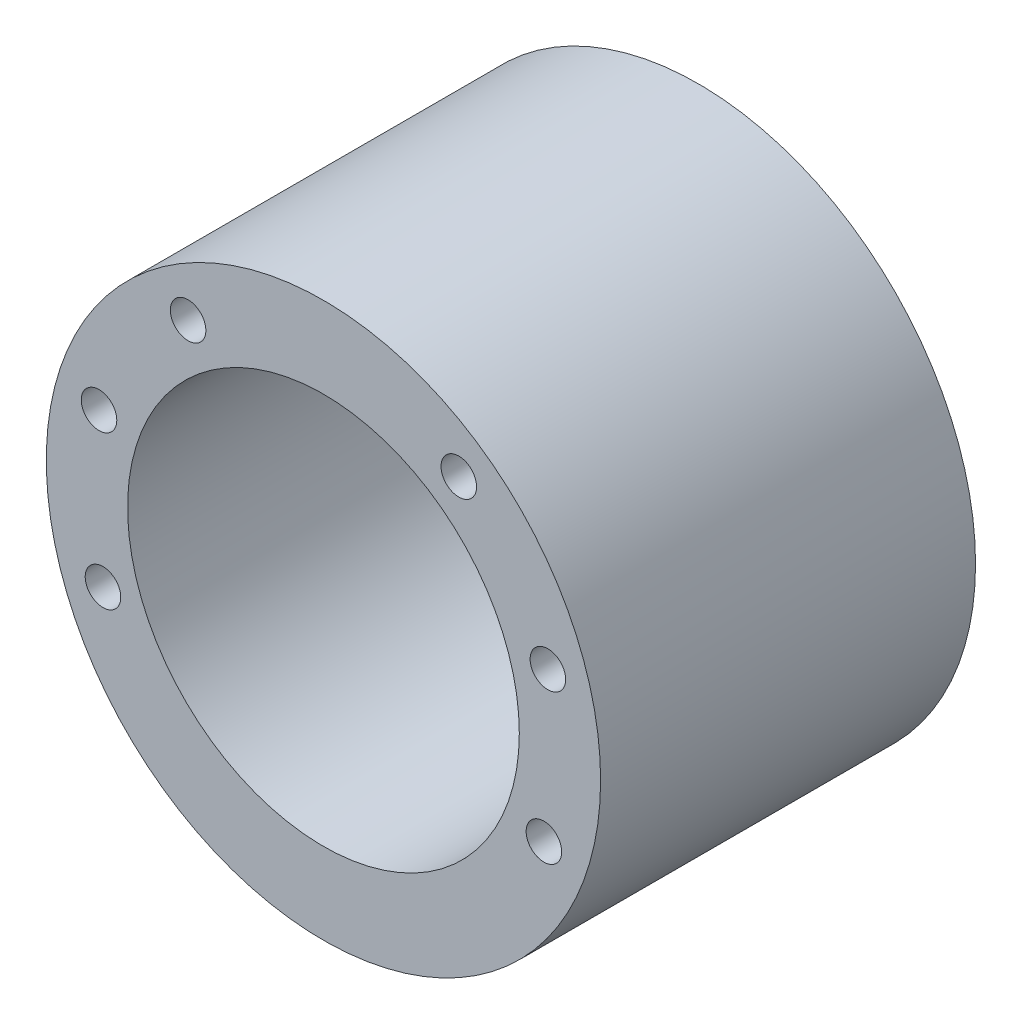
ISO-10303-21;
HEADER;
FILE_DESCRIPTION(('STEP AP214'),'2;1');
FILE_NAME('part.step','',(''),(''),'','','');
FILE_SCHEMA(('AUTOMOTIVE_DESIGN { 1 0 10303 214 1 1 1 1 }'));
ENDSEC;
DATA;
#1=APPLICATION_CONTEXT('core data for automotive mechanical design processes');
#2=APPLICATION_PROTOCOL_DEFINITION('international standard','automotive_design',2000,#1);
#3=PRODUCT_CONTEXT('',#1,'mechanical');
#4=PRODUCT('Part','Part','',(#3));
#5=PRODUCT_RELATED_PRODUCT_CATEGORY('part','',(#4));
#6=PRODUCT_DEFINITION_FORMATION('','',#4);
#7=PRODUCT_DEFINITION_CONTEXT('part definition',#1,'design');
#8=PRODUCT_DEFINITION('design','',#6,#7);
#9=PRODUCT_DEFINITION_SHAPE('','',#8);
#10=(LENGTH_UNIT() NAMED_UNIT(*) SI_UNIT(.MILLI.,.METRE.));
#11=(NAMED_UNIT(*) PLANE_ANGLE_UNIT() SI_UNIT($,.RADIAN.));
#12=(NAMED_UNIT(*) SI_UNIT($,.STERADIAN.) SOLID_ANGLE_UNIT());
#13=UNCERTAINTY_MEASURE_WITH_UNIT(LENGTH_MEASURE(1.E-05),#10,'distance_accuracy_value','');
#14=(GEOMETRIC_REPRESENTATION_CONTEXT(3) GLOBAL_UNCERTAINTY_ASSIGNED_CONTEXT((#13)) GLOBAL_UNIT_ASSIGNED_CONTEXT((#10,
#11,#12)) REPRESENTATION_CONTEXT('',''));
#15=CARTESIAN_POINT('',(0.,0.,0.));
#16=DIRECTION('',(0.,0.,1.));
#17=DIRECTION('',(1.,0.,0.));
#18=AXIS2_PLACEMENT_3D('',#15,#16,#17);
#19=CARTESIAN_POINT('',(0.,0.,-67.));
#20=DIRECTION('',(0.,0.,1.));
#21=DIRECTION('',(1.,0.,0.));
#22=AXIS2_PLACEMENT_3D('',#19,#20,#21);
#23=CYLINDRICAL_SURFACE('',#22,35.);
#24=CARTESIAN_POINT('',(0.,0.,-67.));
#25=DIRECTION('',(0.,0.,1.));
#26=DIRECTION('',(1.,0.,0.));
#27=AXIS2_PLACEMENT_3D('',#24,#25,#26);
#28=CIRCLE('',#27,35.);
#29=CARTESIAN_POINT('',(35.,0.,-67.));
#30=VERTEX_POINT('',#29);
#31=EDGE_CURVE('E47',#30,#30,#28,.T.);
#32=ORIENTED_EDGE('',*,*,#31,.F.);
#33=EDGE_LOOP('',(#32));
#34=FACE_BOUND('',#33,.T.);
#35=CARTESIAN_POINT('',(0.,0.,0.));
#36=DIRECTION('',(0.,0.,1.));
#37=DIRECTION('',(1.,0.,0.));
#38=AXIS2_PLACEMENT_3D('',#35,#36,#37);
#39=CIRCLE('',#38,35.);
#40=CARTESIAN_POINT('',(35.,0.,0.));
#41=VERTEX_POINT('',#40);
#42=EDGE_CURVE('E73',#41,#41,#39,.T.);
#43=ORIENTED_EDGE('',*,*,#42,.T.);
#44=EDGE_LOOP('',(#43));
#45=FACE_BOUND('',#44,.T.);
#46=ADVANCED_FACE('F39',(#34,#45),#23,.F.);
#47=CARTESIAN_POINT('',(40.1046264836395,12.4747318451242,-67.));
#48=DIRECTION('',(0.,0.,1.));
#49=DIRECTION('',(1.,0.,0.));
#50=AXIS2_PLACEMENT_3D('',#47,#48,#49);
#51=CYLINDRICAL_SURFACE('',#50,3.175);
#52=CARTESIAN_POINT('',(40.1046264836395,12.4747318451242,-67.));
#53=DIRECTION('',(0.,0.,1.));
#54=DIRECTION('',(1.,0.,0.));
#55=AXIS2_PLACEMENT_3D('',#52,#53,#54);
#56=CIRCLE('',#55,3.175);
#57=CARTESIAN_POINT('',(43.2796264836396,12.4747318451242,-67.));
#58=VERTEX_POINT('',#57);
#59=EDGE_CURVE('E52',#58,#58,#56,.T.);
#60=ORIENTED_EDGE('',*,*,#59,.F.);
#61=EDGE_LOOP('',(#60));
#62=FACE_BOUND('',#61,.T.);
#63=CARTESIAN_POINT('',(40.1046264836395,12.4747318451242,0.));
#64=DIRECTION('',(0.,0.,1.));
#65=DIRECTION('',(1.,0.,0.));
#66=AXIS2_PLACEMENT_3D('',#63,#64,#65);
#67=CIRCLE('',#66,3.175);
#68=CARTESIAN_POINT('',(43.2796264836396,12.4747318451242,0.));
#69=VERTEX_POINT('',#68);
#70=EDGE_CURVE('E71',#69,#69,#67,.T.);
#71=ORIENTED_EDGE('',*,*,#70,.T.);
#72=EDGE_LOOP('',(#71));
#73=FACE_BOUND('',#72,.T.);
#74=ADVANCED_FACE('F103',(#62,#73),#51,.F.);
#75=CARTESIAN_POINT('',(-39.3971175613913,-14.5556562151595,-67.));
#76=DIRECTION('',(0.,0.,1.));
#77=DIRECTION('',(1.,0.,0.));
#78=AXIS2_PLACEMENT_3D('',#75,#76,#77);
#79=CYLINDRICAL_SURFACE('',#78,3.175);
#80=CARTESIAN_POINT('',(-39.3971175613913,-14.5556562151595,-67.));
#81=DIRECTION('',(0.,0.,1.));
#82=DIRECTION('',(1.,0.,0.));
#83=AXIS2_PLACEMENT_3D('',#80,#81,#82);
#84=CIRCLE('',#83,3.175);
#85=CARTESIAN_POINT('',(-36.2221175613913,-14.5556562151595,-67.));
#86=VERTEX_POINT('',#85);
#87=EDGE_CURVE('E95',#86,#86,#84,.T.);
#88=ORIENTED_EDGE('',*,*,#87,.F.);
#89=EDGE_LOOP('',(#88));
#90=FACE_BOUND('',#89,.T.);
#91=CARTESIAN_POINT('',(-39.3971175613913,-14.5556562151595,0.));
#92=DIRECTION('',(0.,0.,1.));
#93=DIRECTION('',(1.,0.,0.));
#94=AXIS2_PLACEMENT_3D('',#91,#92,#93);
#95=CIRCLE('',#94,3.175);
#96=CARTESIAN_POINT('',(-36.2221175613913,-14.5556562151595,0.));
#97=VERTEX_POINT('',#96);
#98=EDGE_CURVE('E68',#97,#97,#95,.T.);
#99=ORIENTED_EDGE('',*,*,#98,.T.);
#100=EDGE_LOOP('',(#99));
#101=FACE_BOUND('',#100,.T.);
#102=ADVANCED_FACE('F106',(#90,#101),#79,.F.);
#103=CARTESIAN_POINT('',(39.3971175613913,-14.5556562151595,-67.));
#104=DIRECTION('',(0.,0.,1.));
#105=DIRECTION('',(1.,0.,0.));
#106=AXIS2_PLACEMENT_3D('',#103,#104,#105);
#107=CYLINDRICAL_SURFACE('',#106,3.175);
#108=CARTESIAN_POINT('',(39.3971175613913,-14.5556562151595,-67.));
#109=DIRECTION('',(0.,0.,1.));
#110=DIRECTION('',(1.,0.,0.));
#111=AXIS2_PLACEMENT_3D('',#108,#109,#110);
#112=CIRCLE('',#111,3.175);
#113=CARTESIAN_POINT('',(42.5721175613913,-14.5556562151595,-67.));
#114=VERTEX_POINT('',#113);
#115=EDGE_CURVE('E92',#114,#114,#112,.T.);
#116=ORIENTED_EDGE('',*,*,#115,.F.);
#117=EDGE_LOOP('',(#116));
#118=FACE_BOUND('',#117,.T.);
#119=CARTESIAN_POINT('',(39.3971175613913,-14.5556562151595,0.));
#120=DIRECTION('',(0.,0.,1.));
#121=DIRECTION('',(1.,0.,0.));
#122=AXIS2_PLACEMENT_3D('',#119,#120,#121);
#123=CIRCLE('',#122,3.175);
#124=CARTESIAN_POINT('',(42.5721175613913,-14.5556562151595,0.));
#125=VERTEX_POINT('',#124);
#126=EDGE_CURVE('E65',#125,#125,#123,.T.);
#127=ORIENTED_EDGE('',*,*,#126,.T.);
#128=EDGE_LOOP('',(#127));
#129=FACE_BOUND('',#128,.T.);
#130=ADVANCED_FACE('F132',(#118,#129),#107,.F.);
#131=CARTESIAN_POINT('',(-24.1895760147812,34.3345949768615,-67.));
#132=DIRECTION('',(0.,0.,1.));
#133=DIRECTION('',(1.,0.,0.));
#134=AXIS2_PLACEMENT_3D('',#131,#132,#133);
#135=CYLINDRICAL_SURFACE('',#134,3.17500000000009);
#136=CARTESIAN_POINT('',(-24.1895760147812,34.3345949768615,-67.));
#137=DIRECTION('',(0.,0.,1.));
#138=DIRECTION('',(1.,0.,0.));
#139=AXIS2_PLACEMENT_3D('',#136,#137,#138);
#140=CIRCLE('',#139,3.17500000000009);
#141=CARTESIAN_POINT('',(-21.0145760147811,34.3345949768615,-67.));
#142=VERTEX_POINT('',#141);
#143=EDGE_CURVE('E87',#142,#142,#140,.T.);
#144=ORIENTED_EDGE('',*,*,#143,.F.);
#145=EDGE_LOOP('',(#144));
#146=FACE_BOUND('',#145,.T.);
#147=CARTESIAN_POINT('',(-24.1895760147812,34.3345949768615,0.));
#148=DIRECTION('',(0.,0.,1.));
#149=DIRECTION('',(1.,0.,0.));
#150=AXIS2_PLACEMENT_3D('',#147,#148,#149);
#151=CIRCLE('',#150,3.17500000000009);
#152=CARTESIAN_POINT('',(-21.0145760147811,34.3345949768615,0.));
#153=VERTEX_POINT('',#152);
#154=EDGE_CURVE('E62',#153,#153,#151,.T.);
#155=ORIENTED_EDGE('',*,*,#154,.T.);
#156=EDGE_LOOP('',(#155));
#157=FACE_BOUND('',#156,.T.);
#158=ADVANCED_FACE('F136',(#146,#157),#135,.F.);
#159=CARTESIAN_POINT('',(-40.1046264836395,12.4747318451242,-67.));
#160=DIRECTION('',(0.,0.,1.));
#161=DIRECTION('',(1.,0.,0.));
#162=AXIS2_PLACEMENT_3D('',#159,#160,#161);
#163=CYLINDRICAL_SURFACE('',#162,3.175);
#164=CARTESIAN_POINT('',(-40.1046264836395,12.4747318451242,-67.));
#165=DIRECTION('',(0.,0.,1.));
#166=DIRECTION('',(1.,0.,0.));
#167=AXIS2_PLACEMENT_3D('',#164,#165,#166);
#168=CIRCLE('',#167,3.175);
#169=CARTESIAN_POINT('',(-36.9296264836396,12.4747318451242,-67.));
#170=VERTEX_POINT('',#169);
#171=EDGE_CURVE('E82',#170,#170,#168,.T.);
#172=ORIENTED_EDGE('',*,*,#171,.F.);
#173=EDGE_LOOP('',(#172));
#174=FACE_BOUND('',#173,.T.);
#175=CARTESIAN_POINT('',(-40.1046264836395,12.4747318451242,0.));
#176=DIRECTION('',(0.,0.,1.));
#177=DIRECTION('',(1.,0.,0.));
#178=AXIS2_PLACEMENT_3D('',#175,#176,#177);
#179=CIRCLE('',#178,3.175);
#180=CARTESIAN_POINT('',(-36.9296264836396,12.4747318451242,0.));
#181=VERTEX_POINT('',#180);
#182=EDGE_CURVE('E59',#181,#181,#179,.T.);
#183=ORIENTED_EDGE('',*,*,#182,.T.);
#184=EDGE_LOOP('',(#183));
#185=FACE_BOUND('',#184,.T.);
#186=ADVANCED_FACE('F139',(#174,#185),#163,.F.);
#187=CARTESIAN_POINT('',(24.1895760147812,34.3345949768615,-67.));
#188=DIRECTION('',(0.,0.,1.));
#189=DIRECTION('',(1.,0.,0.));
#190=AXIS2_PLACEMENT_3D('',#187,#188,#189);
#191=CYLINDRICAL_SURFACE('',#190,3.17500000000002);
#192=CARTESIAN_POINT('',(24.1895760147812,34.3345949768615,-67.));
#193=DIRECTION('',(0.,0.,1.));
#194=DIRECTION('',(1.,0.,0.));
#195=AXIS2_PLACEMENT_3D('',#192,#193,#194);
#196=CIRCLE('',#195,3.17500000000002);
#197=CARTESIAN_POINT('',(27.3645760147812,34.3345949768615,-67.));
#198=VERTEX_POINT('',#197);
#199=EDGE_CURVE('E78',#198,#198,#196,.T.);
#200=ORIENTED_EDGE('',*,*,#199,.F.);
#201=EDGE_LOOP('',(#200));
#202=FACE_BOUND('',#201,.T.);
#203=CARTESIAN_POINT('',(24.1895760147812,34.3345949768615,0.));
#204=DIRECTION('',(0.,0.,1.));
#205=DIRECTION('',(1.,0.,0.));
#206=AXIS2_PLACEMENT_3D('',#203,#204,#205);
#207=CIRCLE('',#206,3.17500000000002);
#208=CARTESIAN_POINT('',(27.3645760147812,34.3345949768615,0.));
#209=VERTEX_POINT('',#208);
#210=EDGE_CURVE('E56',#209,#209,#207,.T.);
#211=ORIENTED_EDGE('',*,*,#210,.T.);
#212=EDGE_LOOP('',(#211));
#213=FACE_BOUND('',#212,.T.);
#214=ADVANCED_FACE('F41',(#202,#213),#191,.F.);
#215=CARTESIAN_POINT('',(0.,0.,-67.));
#216=DIRECTION('',(0.,0.,1.));
#217=DIRECTION('',(1.,0.,0.));
#218=AXIS2_PLACEMENT_3D('',#215,#216,#217);
#219=CYLINDRICAL_SURFACE('',#218,49.53);
#220=CARTESIAN_POINT('',(0.,0.,-67.));
#221=DIRECTION('',(0.,0.,1.));
#222=DIRECTION('',(1.,0.,0.));
#223=AXIS2_PLACEMENT_3D('',#220,#221,#222);
#224=CIRCLE('',#223,49.53);
#225=CARTESIAN_POINT('',(49.53,0.,-67.));
#226=VERTEX_POINT('',#225);
#227=EDGE_CURVE('E10',#226,#226,#224,.T.);
#228=ORIENTED_EDGE('',*,*,#227,.T.);
#229=EDGE_LOOP('',(#228));
#230=FACE_BOUND('',#229,.T.);
#231=CARTESIAN_POINT('',(0.,0.,0.));
#232=DIRECTION('',(0.,0.,1.));
#233=DIRECTION('',(1.,0.,0.));
#234=AXIS2_PLACEMENT_3D('',#231,#232,#233);
#235=CIRCLE('',#234,49.53);
#236=CARTESIAN_POINT('',(49.53,0.,0.));
#237=VERTEX_POINT('',#236);
#238=EDGE_CURVE('E43',#237,#237,#235,.T.);
#239=ORIENTED_EDGE('',*,*,#238,.F.);
#240=EDGE_LOOP('',(#239));
#241=FACE_BOUND('',#240,.T.);
#242=ADVANCED_FACE('F118',(#230,#241),#219,.T.);
#243=CARTESIAN_POINT('',(0.,0.,-67.));
#244=DIRECTION('',(0.,0.,1.));
#245=DIRECTION('',(1.,0.,0.));
#246=AXIS2_PLACEMENT_3D('',#243,#244,#245);
#247=PLANE('',#246);
#248=ORIENTED_EDGE('',*,*,#199,.T.);
#249=EDGE_LOOP('',(#248));
#250=FACE_BOUND('',#249,.T.);
#251=ORIENTED_EDGE('',*,*,#171,.T.);
#252=EDGE_LOOP('',(#251));
#253=FACE_BOUND('',#252,.T.);
#254=ORIENTED_EDGE('',*,*,#143,.T.);
#255=EDGE_LOOP('',(#254));
#256=FACE_BOUND('',#255,.T.);
#257=ORIENTED_EDGE('',*,*,#115,.T.);
#258=EDGE_LOOP('',(#257));
#259=FACE_BOUND('',#258,.T.);
#260=ORIENTED_EDGE('',*,*,#87,.T.);
#261=EDGE_LOOP('',(#260));
#262=FACE_BOUND('',#261,.T.);
#263=ORIENTED_EDGE('',*,*,#59,.T.);
#264=EDGE_LOOP('',(#263));
#265=FACE_BOUND('',#264,.T.);
#266=ORIENTED_EDGE('',*,*,#31,.T.);
#267=EDGE_LOOP('',(#266));
#268=FACE_BOUND('',#267,.T.);
#269=ORIENTED_EDGE('',*,*,#227,.F.);
#270=EDGE_LOOP('',(#269));
#271=FACE_BOUND('',#270,.T.);
#272=ADVANCED_FACE('F100',(#250,#253,#256,#259,#262,#265,#268,#271),#247,.F.);
#273=CARTESIAN_POINT('',(0.,0.,0.));
#274=DIRECTION('',(0.,0.,1.));
#275=DIRECTION('',(1.,0.,0.));
#276=AXIS2_PLACEMENT_3D('',#273,#274,#275);
#277=PLANE('',#276);
#278=ORIENTED_EDGE('',*,*,#210,.F.);
#279=EDGE_LOOP('',(#278));
#280=FACE_BOUND('',#279,.T.);
#281=ORIENTED_EDGE('',*,*,#182,.F.);
#282=EDGE_LOOP('',(#281));
#283=FACE_BOUND('',#282,.T.);
#284=ORIENTED_EDGE('',*,*,#154,.F.);
#285=EDGE_LOOP('',(#284));
#286=FACE_BOUND('',#285,.T.);
#287=ORIENTED_EDGE('',*,*,#126,.F.);
#288=EDGE_LOOP('',(#287));
#289=FACE_BOUND('',#288,.T.);
#290=ORIENTED_EDGE('',*,*,#98,.F.);
#291=EDGE_LOOP('',(#290));
#292=FACE_BOUND('',#291,.T.);
#293=ORIENTED_EDGE('',*,*,#70,.F.);
#294=EDGE_LOOP('',(#293));
#295=FACE_BOUND('',#294,.T.);
#296=ORIENTED_EDGE('',*,*,#42,.F.);
#297=EDGE_LOOP('',(#296));
#298=FACE_BOUND('',#297,.T.);
#299=ORIENTED_EDGE('',*,*,#238,.T.);
#300=EDGE_LOOP('',(#299));
#301=FACE_BOUND('',#300,.T.);
#302=ADVANCED_FACE('F110',(#280,#283,#286,#289,#292,#295,#298,#301),#277,.T.);
#303=CLOSED_SHELL('',(#46,#74,#102,#130,#158,#186,#214,#242,#272,#302));
#304=MANIFOLD_SOLID_BREP('B2',#303);
#305=ADVANCED_BREP_SHAPE_REPRESENTATION('',(#18,#304),#14);
#306=SHAPE_DEFINITION_REPRESENTATION(#9,#305);
ENDSEC;
END-ISO-10303-21;
